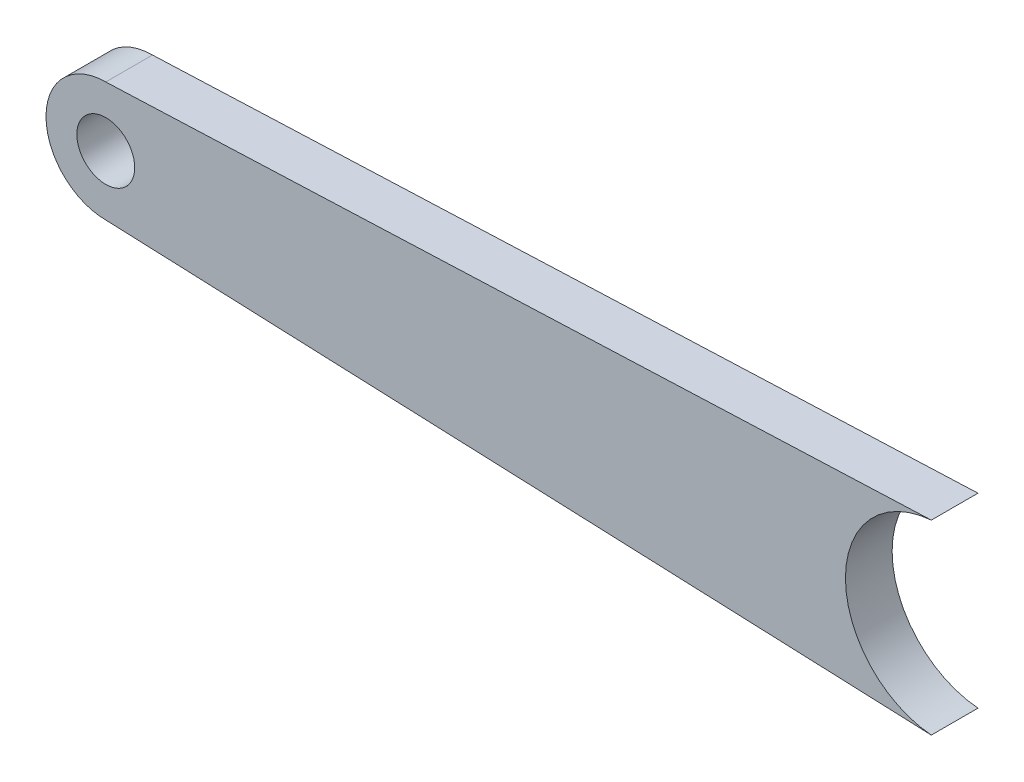
ISO-10303-21;
HEADER;
FILE_DESCRIPTION(('STEP AP214'),'2;1');
FILE_NAME('part.step','',(''),(''),'','','');
FILE_SCHEMA(('AUTOMOTIVE_DESIGN { 1 0 10303 214 1 1 1 1 }'));
ENDSEC;
DATA;
#1=APPLICATION_CONTEXT('core data for automotive mechanical design processes');
#2=APPLICATION_PROTOCOL_DEFINITION('international standard','automotive_design',2000,#1);
#3=PRODUCT_CONTEXT('',#1,'mechanical');
#4=PRODUCT('Part','Part','',(#3));
#5=PRODUCT_RELATED_PRODUCT_CATEGORY('part','',(#4));
#6=PRODUCT_DEFINITION_FORMATION('','',#4);
#7=PRODUCT_DEFINITION_CONTEXT('part definition',#1,'design');
#8=PRODUCT_DEFINITION('design','',#6,#7);
#9=PRODUCT_DEFINITION_SHAPE('','',#8);
#10=(LENGTH_UNIT() NAMED_UNIT(*) SI_UNIT(.MILLI.,.METRE.));
#11=(NAMED_UNIT(*) PLANE_ANGLE_UNIT() SI_UNIT($,.RADIAN.));
#12=(NAMED_UNIT(*) SI_UNIT($,.STERADIAN.) SOLID_ANGLE_UNIT());
#13=UNCERTAINTY_MEASURE_WITH_UNIT(LENGTH_MEASURE(1.E-05),#10,'distance_accuracy_value','');
#14=(GEOMETRIC_REPRESENTATION_CONTEXT(3) GLOBAL_UNCERTAINTY_ASSIGNED_CONTEXT((#13)) GLOBAL_UNIT_ASSIGNED_CONTEXT((#10,
#11,#12)) REPRESENTATION_CONTEXT('',''));
#15=CARTESIAN_POINT('',(0.,0.,0.));
#16=DIRECTION('',(0.,0.,1.));
#17=DIRECTION('',(1.,0.,0.));
#18=AXIS2_PLACEMENT_3D('',#15,#16,#17);
#19=CARTESIAN_POINT('',(0.,0.,6.35));
#20=DIRECTION('',(0.,0.,1.));
#21=DIRECTION('',(1.,0.,0.));
#22=AXIS2_PLACEMENT_3D('',#19,#20,#21);
#23=PLANE('',#22);
#24=CARTESIAN_POINT('',(0.,0.,6.35));
#25=DIRECTION('',(0.,0.,1.));
#26=DIRECTION('',(1.,0.,0.));
#27=AXIS2_PLACEMENT_3D('',#24,#25,#26);
#28=CIRCLE('',#27,8.128);
#29=CARTESIAN_POINT('',(0.,8.128,6.35));
#30=VERTEX_POINT('',#29);
#31=CARTESIAN_POINT('',(0.,-8.128,6.35));
#32=VERTEX_POINT('',#31);
#33=EDGE_CURVE('E11',#30,#32,#28,.T.);
#34=ORIENTED_EDGE('',*,*,#33,.T.);
#35=DIRECTION('',(0.999186579432474,-0.0403259157618487,0.));
#36=VECTOR('',#35,1.);
#37=CARTESIAN_POINT('',(-0.327502429231078,-8.11478241317005,6.35));
#38=LINE('',#37,#36);
#39=CARTESIAN_POINT('',(112.260554908652,-12.6586950411564,6.35));
#40=VERTEX_POINT('',#39);
#41=EDGE_CURVE('E110',#32,#40,#38,.T.);
#42=ORIENTED_EDGE('',*,*,#41,.T.);
#43=CARTESIAN_POINT('',(113.284,0.,6.35));
#44=DIRECTION('',(0.,0.,1.));
#45=DIRECTION('',(1.,0.,0.));
#46=AXIS2_PLACEMENT_3D('',#43,#44,#45);
#47=CIRCLE('',#46,12.7);
#48=CARTESIAN_POINT('',(112.260554908652,12.6586950411564,6.35));
#49=VERTEX_POINT('',#48);
#50=EDGE_CURVE('E114',#49,#40,#47,.T.);
#51=ORIENTED_EDGE('',*,*,#50,.F.);
#52=DIRECTION('',(0.999186579432474,0.0403259157618487,0.));
#53=VECTOR('',#52,1.);
#54=CARTESIAN_POINT('',(-0.327502429231078,8.11478241317005,6.35));
#55=LINE('',#54,#53);
#56=EDGE_CURVE('E50',#30,#49,#55,.T.);
#57=ORIENTED_EDGE('',*,*,#56,.F.);
#58=EDGE_LOOP('',(#34,#42,#51,#57));
#59=FACE_BOUND('',#58,.T.);
#60=CARTESIAN_POINT('',(0.,0.,6.35));
#61=DIRECTION('',(0.,0.,1.));
#62=DIRECTION('',(1.,0.,0.));
#63=AXIS2_PLACEMENT_3D('',#60,#61,#62);
#64=CIRCLE('',#63,3.937);
#65=CARTESIAN_POINT('',(3.937,0.,6.35));
#66=VERTEX_POINT('',#65);
#67=EDGE_CURVE('E98',#66,#66,#64,.T.);
#68=ORIENTED_EDGE('',*,*,#67,.F.);
#69=EDGE_LOOP('',(#68));
#70=FACE_BOUND('',#69,.T.);
#71=ADVANCED_FACE('F36',(#59,#70),#23,.T.);
#72=CARTESIAN_POINT('',(0.,0.,0.));
#73=DIRECTION('',(0.,0.,1.));
#74=DIRECTION('',(1.,0.,0.));
#75=AXIS2_PLACEMENT_3D('',#72,#73,#74);
#76=PLANE('',#75);
#77=CARTESIAN_POINT('',(0.,0.,0.));
#78=DIRECTION('',(0.,0.,1.));
#79=DIRECTION('',(1.,0.,0.));
#80=AXIS2_PLACEMENT_3D('',#77,#78,#79);
#81=CIRCLE('',#80,8.128);
#82=CARTESIAN_POINT('',(0.,8.128,0.));
#83=VERTEX_POINT('',#82);
#84=CARTESIAN_POINT('',(0.,-8.128,0.));
#85=VERTEX_POINT('',#84);
#86=EDGE_CURVE('E40',#83,#85,#81,.T.);
#87=ORIENTED_EDGE('',*,*,#86,.F.);
#88=DIRECTION('',(0.999186579432474,0.0403259157618487,0.));
#89=VECTOR('',#88,1.);
#90=CARTESIAN_POINT('',(-0.327502429231078,8.11478241317005,0.));
#91=LINE('',#90,#89);
#92=CARTESIAN_POINT('',(112.260554908652,12.6586950411564,0.));
#93=VERTEX_POINT('',#92);
#94=EDGE_CURVE('E80',#83,#93,#91,.T.);
#95=ORIENTED_EDGE('',*,*,#94,.T.);
#96=CARTESIAN_POINT('',(113.284,0.,0.));
#97=DIRECTION('',(0.,0.,1.));
#98=DIRECTION('',(1.,0.,0.));
#99=AXIS2_PLACEMENT_3D('',#96,#97,#98);
#100=CIRCLE('',#99,12.7);
#101=CARTESIAN_POINT('',(112.260554908652,-12.6586950411564,0.));
#102=VERTEX_POINT('',#101);
#103=EDGE_CURVE('E59',#93,#102,#100,.T.);
#104=ORIENTED_EDGE('',*,*,#103,.T.);
#105=DIRECTION('',(0.999186579432474,-0.0403259157618487,0.));
#106=VECTOR('',#105,1.);
#107=CARTESIAN_POINT('',(-0.327502429231078,-8.11478241317005,0.));
#108=LINE('',#107,#106);
#109=EDGE_CURVE('E89',#85,#102,#108,.T.);
#110=ORIENTED_EDGE('',*,*,#109,.F.);
#111=EDGE_LOOP('',(#87,#95,#104,#110));
#112=FACE_BOUND('',#111,.T.);
#113=CARTESIAN_POINT('',(0.,0.,0.));
#114=DIRECTION('',(0.,0.,1.));
#115=DIRECTION('',(1.,0.,0.));
#116=AXIS2_PLACEMENT_3D('',#113,#114,#115);
#117=CIRCLE('',#116,3.937);
#118=CARTESIAN_POINT('',(3.937,0.,0.));
#119=VERTEX_POINT('',#118);
#120=EDGE_CURVE('E100',#119,#119,#117,.T.);
#121=ORIENTED_EDGE('',*,*,#120,.T.);
#122=EDGE_LOOP('',(#121));
#123=FACE_BOUND('',#122,.T.);
#124=ADVANCED_FACE('F96',(#112,#123),#76,.F.);
#125=CARTESIAN_POINT('',(0.,0.,6.35));
#126=DIRECTION('',(0.,0.,-1.));
#127=DIRECTION('',(-1.,0.,0.));
#128=AXIS2_PLACEMENT_3D('',#125,#126,#127);
#129=CYLINDRICAL_SURFACE('',#128,8.128);
#130=ORIENTED_EDGE('',*,*,#86,.T.);
#131=DIRECTION('',(0.,0.,1.));
#132=VECTOR('',#131,1.);
#133=CARTESIAN_POINT('',(0.,-8.128,0.));
#134=LINE('',#133,#132);
#135=EDGE_CURVE('E94',#85,#32,#134,.T.);
#136=ORIENTED_EDGE('',*,*,#135,.T.);
#137=ORIENTED_EDGE('',*,*,#33,.F.);
#138=DIRECTION('',(0.,0.,1.));
#139=VECTOR('',#138,1.);
#140=CARTESIAN_POINT('',(0.,8.128,0.));
#141=LINE('',#140,#139);
#142=EDGE_CURVE('E85',#83,#30,#141,.T.);
#143=ORIENTED_EDGE('',*,*,#142,.F.);
#144=EDGE_LOOP('',(#130,#136,#137,#143));
#145=FACE_BOUND('',#144,.T.);
#146=ADVANCED_FACE('F38',(#145),#129,.T.);
#147=CARTESIAN_POINT('',(0.,0.,6.35));
#148=DIRECTION('',(0.,0.,-1.));
#149=DIRECTION('',(-1.,0.,0.));
#150=AXIS2_PLACEMENT_3D('',#147,#148,#149);
#151=CYLINDRICAL_SURFACE('',#150,3.937);
#152=ORIENTED_EDGE('',*,*,#67,.T.);
#153=EDGE_LOOP('',(#152));
#154=FACE_BOUND('',#153,.T.);
#155=ORIENTED_EDGE('',*,*,#120,.F.);
#156=EDGE_LOOP('',(#155));
#157=FACE_BOUND('',#156,.T.);
#158=ADVANCED_FACE('F122',(#154,#157),#151,.F.);
#159=CARTESIAN_POINT('',(113.284,0.,0.));
#160=DIRECTION('',(0.,0.,1.));
#161=DIRECTION('',(1.,0.,0.));
#162=AXIS2_PLACEMENT_3D('',#159,#160,#161);
#163=CYLINDRICAL_SURFACE('',#162,12.7);
#164=ORIENTED_EDGE('',*,*,#50,.T.);
#165=DIRECTION('',(0.,0.,1.));
#166=VECTOR('',#165,1.);
#167=CARTESIAN_POINT('',(112.260554908652,-12.6586950411564,0.));
#168=LINE('',#167,#166);
#169=EDGE_CURVE('E75',#102,#40,#168,.T.);
#170=ORIENTED_EDGE('',*,*,#169,.F.);
#171=ORIENTED_EDGE('',*,*,#103,.F.);
#172=DIRECTION('',(0.,0.,1.));
#173=VECTOR('',#172,1.);
#174=CARTESIAN_POINT('',(112.260554908652,12.6586950411564,0.));
#175=LINE('',#174,#173);
#176=EDGE_CURVE('E88',#93,#49,#175,.T.);
#177=ORIENTED_EDGE('',*,*,#176,.T.);
#178=EDGE_LOOP('',(#164,#170,#171,#177));
#179=FACE_BOUND('',#178,.T.);
#180=ADVANCED_FACE('F120',(#179),#163,.F.);
#181=CARTESIAN_POINT('',(-0.327502429231078,-8.11478241317005,0.));
#182=DIRECTION('',(-0.0403259157618487,-0.999186579432474,0.));
#183=DIRECTION('',(0.999186579432474,-0.0403259157618487,0.));
#184=AXIS2_PLACEMENT_3D('',#181,#182,#183);
#185=PLANE('',#184);
#186=ORIENTED_EDGE('',*,*,#41,.F.);
#187=ORIENTED_EDGE('',*,*,#135,.F.);
#188=ORIENTED_EDGE('',*,*,#109,.T.);
#189=ORIENTED_EDGE('',*,*,#169,.T.);
#190=EDGE_LOOP('',(#186,#187,#188,#189));
#191=FACE_BOUND('',#190,.T.);
#192=ADVANCED_FACE('F117',(#191),#185,.T.);
#193=CARTESIAN_POINT('',(-0.327502429231078,8.11478241317005,0.));
#194=DIRECTION('',(0.0403259157618487,-0.999186579432474,0.));
#195=DIRECTION('',(0.999186579432474,0.0403259157618487,0.));
#196=AXIS2_PLACEMENT_3D('',#193,#194,#195);
#197=PLANE('',#196);
#198=ORIENTED_EDGE('',*,*,#56,.T.);
#199=ORIENTED_EDGE('',*,*,#176,.F.);
#200=ORIENTED_EDGE('',*,*,#94,.F.);
#201=ORIENTED_EDGE('',*,*,#142,.T.);
#202=EDGE_LOOP('',(#198,#199,#200,#201));
#203=FACE_BOUND('',#202,.T.);
#204=ADVANCED_FACE('F84',(#203),#197,.F.);
#205=CLOSED_SHELL('',(#71,#124,#146,#158,#180,#192,#204));
#206=MANIFOLD_SOLID_BREP('B2',#205);
#207=ADVANCED_BREP_SHAPE_REPRESENTATION('',(#18,#206),#14);
#208=SHAPE_DEFINITION_REPRESENTATION(#9,#207);
ENDSEC;
END-ISO-10303-21;
